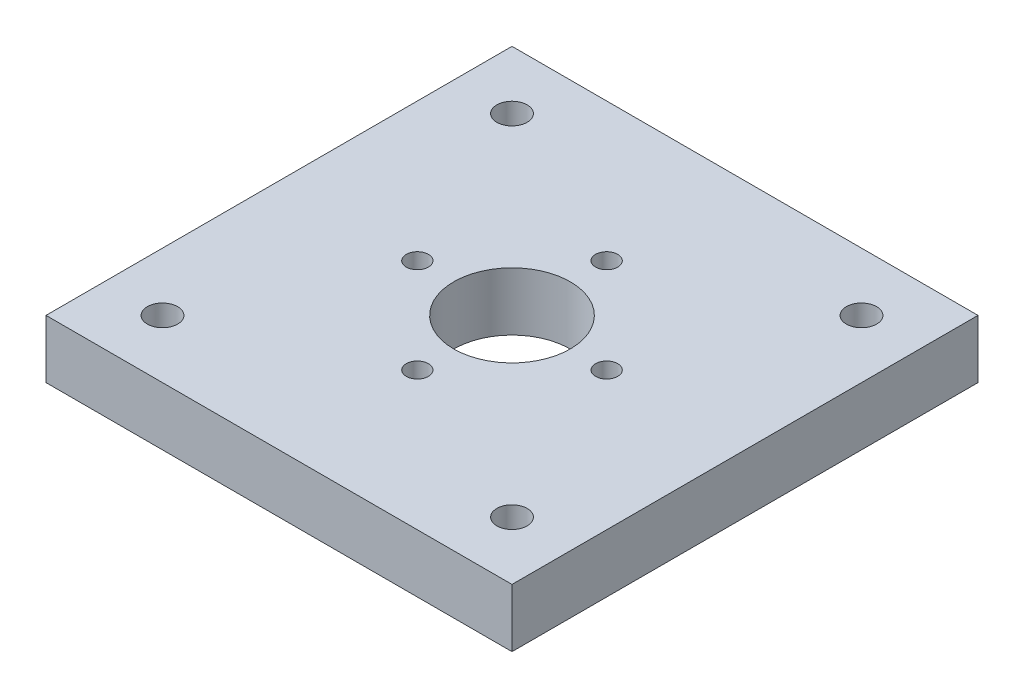
ISO-10303-21;
HEADER;
FILE_DESCRIPTION(('STEP AP214'),'2;1');
FILE_NAME('part.step','',(''),(''),'','','');
FILE_SCHEMA(('AUTOMOTIVE_DESIGN { 1 0 10303 214 1 1 1 1 }'));
ENDSEC;
DATA;
#1=APPLICATION_CONTEXT('core data for automotive mechanical design processes');
#2=APPLICATION_PROTOCOL_DEFINITION('international standard','automotive_design',2000,#1);
#3=PRODUCT_CONTEXT('',#1,'mechanical');
#4=PRODUCT('Part','Part','',(#3));
#5=PRODUCT_RELATED_PRODUCT_CATEGORY('part','',(#4));
#6=PRODUCT_DEFINITION_FORMATION('','',#4);
#7=PRODUCT_DEFINITION_CONTEXT('part definition',#1,'design');
#8=PRODUCT_DEFINITION('design','',#6,#7);
#9=PRODUCT_DEFINITION_SHAPE('','',#8);
#10=(LENGTH_UNIT() NAMED_UNIT(*) SI_UNIT(.MILLI.,.METRE.));
#11=(NAMED_UNIT(*) PLANE_ANGLE_UNIT() SI_UNIT($,.RADIAN.));
#12=(NAMED_UNIT(*) SI_UNIT($,.STERADIAN.) SOLID_ANGLE_UNIT());
#13=UNCERTAINTY_MEASURE_WITH_UNIT(LENGTH_MEASURE(1.E-05),#10,'distance_accuracy_value','');
#14=(GEOMETRIC_REPRESENTATION_CONTEXT(3) GLOBAL_UNCERTAINTY_ASSIGNED_CONTEXT((#13)) GLOBAL_UNIT_ASSIGNED_CONTEXT((#10,
#11,#12)) REPRESENTATION_CONTEXT('',''));
#15=CARTESIAN_POINT('',(0.,0.,0.));
#16=DIRECTION('',(0.,0.,1.));
#17=DIRECTION('',(1.,0.,0.));
#18=AXIS2_PLACEMENT_3D('',#15,#16,#17);
#19=CARTESIAN_POINT('',(0.,0.5,0.));
#20=DIRECTION('',(0.,1.,0.));
#21=DIRECTION('',(0.,0.,1.));
#22=AXIS2_PLACEMENT_3D('',#19,#20,#21);
#23=PLANE('',#22);
#24=CARTESIAN_POINT('',(0.,0.5,0.812500000000001));
#25=DIRECTION('',(0.,1.,0.));
#26=DIRECTION('',(0.,0.,1.));
#27=AXIS2_PLACEMENT_3D('',#24,#25,#26);
#28=CIRCLE('',#27,0.095);
#29=CARTESIAN_POINT('',(0.,0.5,0.907500000000001));
#30=VERTEX_POINT('',#29);
#31=EDGE_CURVE('E155',#30,#30,#28,.T.);
#32=ORIENTED_EDGE('',*,*,#31,.F.);
#33=EDGE_LOOP('',(#32));
#34=FACE_BOUND('',#33,.T.);
#35=CARTESIAN_POINT('',(0.,0.5,-0.812500000000001));
#36=DIRECTION('',(0.,1.,0.));
#37=DIRECTION('',(0.,0.,1.));
#38=AXIS2_PLACEMENT_3D('',#35,#36,#37);
#39=CIRCLE('',#38,0.095);
#40=CARTESIAN_POINT('',(0.,0.5,-0.717500000000001));
#41=VERTEX_POINT('',#40);
#42=EDGE_CURVE('E143',#41,#41,#39,.T.);
#43=ORIENTED_EDGE('',*,*,#42,.F.);
#44=EDGE_LOOP('',(#43));
#45=FACE_BOUND('',#44,.T.);
#46=CARTESIAN_POINT('',(-1.5,0.5,1.5));
#47=DIRECTION('',(0.,1.,0.));
#48=DIRECTION('',(0.,0.,-1.));
#49=AXIS2_PLACEMENT_3D('',#46,#47,#48);
#50=CIRCLE('',#49,0.13);
#51=CARTESIAN_POINT('',(-1.5,0.5,1.37));
#52=VERTEX_POINT('',#51);
#53=EDGE_CURVE('E131',#52,#52,#50,.T.);
#54=ORIENTED_EDGE('',*,*,#53,.F.);
#55=EDGE_LOOP('',(#54));
#56=FACE_BOUND('',#55,.T.);
#57=CARTESIAN_POINT('',(1.5,0.5,-1.5));
#58=DIRECTION('',(0.,1.,0.));
#59=DIRECTION('',(0.,0.,-1.));
#60=AXIS2_PLACEMENT_3D('',#57,#58,#59);
#61=CIRCLE('',#60,0.13);
#62=CARTESIAN_POINT('',(1.5,0.5,-1.63));
#63=VERTEX_POINT('',#62);
#64=EDGE_CURVE('E119',#63,#63,#61,.T.);
#65=ORIENTED_EDGE('',*,*,#64,.F.);
#66=EDGE_LOOP('',(#65));
#67=FACE_BOUND('',#66,.T.);
#68=DIRECTION('',(0.,0.,-1.));
#69=VECTOR('',#68,1.);
#70=CARTESIAN_POINT('',(2.,0.5,-2.));
#71=LINE('',#70,#69);
#72=CARTESIAN_POINT('',(2.,0.5,2.));
#73=VERTEX_POINT('',#72);
#74=CARTESIAN_POINT('',(2.,0.5,-2.));
#75=VERTEX_POINT('',#74);
#76=EDGE_CURVE('E89',#73,#75,#71,.T.);
#77=ORIENTED_EDGE('',*,*,#76,.T.);
#78=DIRECTION('',(-1.,0.,0.));
#79=VECTOR('',#78,1.);
#80=CARTESIAN_POINT('',(-2.,0.5,-2.));
#81=LINE('',#80,#79);
#82=CARTESIAN_POINT('',(-2.,0.5,-2.));
#83=VERTEX_POINT('',#82);
#84=EDGE_CURVE('E84',#75,#83,#81,.T.);
#85=ORIENTED_EDGE('',*,*,#84,.T.);
#86=DIRECTION('',(0.,0.,1.));
#87=VECTOR('',#86,1.);
#88=CARTESIAN_POINT('',(-2.,0.5,-2.));
#89=LINE('',#88,#87);
#90=CARTESIAN_POINT('',(-2.,0.5,2.));
#91=VERTEX_POINT('',#90);
#92=EDGE_CURVE('E87',#83,#91,#89,.T.);
#93=ORIENTED_EDGE('',*,*,#92,.T.);
#94=DIRECTION('',(1.,0.,0.));
#95=VECTOR('',#94,1.);
#96=CARTESIAN_POINT('',(-2.,0.5,2.));
#97=LINE('',#96,#95);
#98=EDGE_CURVE('E54',#91,#73,#97,.T.);
#99=ORIENTED_EDGE('',*,*,#98,.T.);
#100=EDGE_LOOP('',(#77,#85,#93,#99));
#101=FACE_BOUND('',#100,.T.);
#102=CARTESIAN_POINT('',(-1.5,0.5,-1.5));
#103=DIRECTION('',(0.,1.,0.));
#104=DIRECTION('',(0.,0.,1.));
#105=AXIS2_PLACEMENT_3D('',#102,#103,#104);
#106=CIRCLE('',#105,0.13);
#107=CARTESIAN_POINT('',(-1.5,0.5,-1.37));
#108=VERTEX_POINT('',#107);
#109=EDGE_CURVE('E104',#108,#108,#106,.T.);
#110=ORIENTED_EDGE('',*,*,#109,.F.);
#111=EDGE_LOOP('',(#110));
#112=FACE_BOUND('',#111,.T.);
#113=CARTESIAN_POINT('',(1.5,0.5,1.5));
#114=DIRECTION('',(0.,1.,0.));
#115=DIRECTION('',(0.,0.,1.));
#116=AXIS2_PLACEMENT_3D('',#113,#114,#115);
#117=CIRCLE('',#116,0.13);
#118=CARTESIAN_POINT('',(1.5,0.5,1.63));
#119=VERTEX_POINT('',#118);
#120=EDGE_CURVE('E125',#119,#119,#117,.T.);
#121=ORIENTED_EDGE('',*,*,#120,.F.);
#122=EDGE_LOOP('',(#121));
#123=FACE_BOUND('',#122,.T.);
#124=CARTESIAN_POINT('',(0.,0.5,0.));
#125=DIRECTION('',(0.,1.,0.));
#126=DIRECTION('',(0.,0.,1.));
#127=AXIS2_PLACEMENT_3D('',#124,#125,#126);
#128=CIRCLE('',#127,0.5);
#129=CARTESIAN_POINT('',(0.,0.5,0.499999999999999));
#130=VERTEX_POINT('',#129);
#131=EDGE_CURVE('E137',#130,#130,#128,.T.);
#132=ORIENTED_EDGE('',*,*,#131,.F.);
#133=EDGE_LOOP('',(#132));
#134=FACE_BOUND('',#133,.T.);
#135=CARTESIAN_POINT('',(0.812500000000001,0.5,0.));
#136=DIRECTION('',(0.,1.,0.));
#137=DIRECTION('',(0.,0.,1.));
#138=AXIS2_PLACEMENT_3D('',#135,#136,#137);
#139=CIRCLE('',#138,0.095);
#140=CARTESIAN_POINT('',(0.812500000000001,0.5,0.0950000000000037));
#141=VERTEX_POINT('',#140);
#142=EDGE_CURVE('E149',#141,#141,#139,.T.);
#143=ORIENTED_EDGE('',*,*,#142,.F.);
#144=EDGE_LOOP('',(#143));
#145=FACE_BOUND('',#144,.T.);
#146=CARTESIAN_POINT('',(-0.812500000000001,0.5,0.));
#147=DIRECTION('',(0.,1.,0.));
#148=DIRECTION('',(0.,0.,1.));
#149=AXIS2_PLACEMENT_3D('',#146,#147,#148);
#150=CIRCLE('',#149,0.095);
#151=CARTESIAN_POINT('',(-0.812500000000001,0.5,0.0949999999999906));
#152=VERTEX_POINT('',#151);
#153=EDGE_CURVE('E161',#152,#152,#150,.T.);
#154=ORIENTED_EDGE('',*,*,#153,.F.);
#155=EDGE_LOOP('',(#154));
#156=FACE_BOUND('',#155,.T.);
#157=ADVANCED_FACE('F37',(#34,#45,#56,#67,#101,#112,#123,#134,#145,#156),#23,.T.);
#158=CARTESIAN_POINT('',(0.,0.,0.));
#159=DIRECTION('',(0.,1.,0.));
#160=DIRECTION('',(0.,0.,1.));
#161=AXIS2_PLACEMENT_3D('',#158,#159,#160);
#162=PLANE('',#161);
#163=DIRECTION('',(0.,0.,-1.));
#164=VECTOR('',#163,1.);
#165=CARTESIAN_POINT('',(2.,0.,-2.));
#166=LINE('',#165,#164);
#167=CARTESIAN_POINT('',(2.,0.,2.));
#168=VERTEX_POINT('',#167);
#169=CARTESIAN_POINT('',(2.,0.,-2.));
#170=VERTEX_POINT('',#169);
#171=EDGE_CURVE('E101',#168,#170,#166,.T.);
#172=ORIENTED_EDGE('',*,*,#171,.F.);
#173=DIRECTION('',(1.,0.,0.));
#174=VECTOR('',#173,1.);
#175=CARTESIAN_POINT('',(-2.,0.,2.));
#176=LINE('',#175,#174);
#177=CARTESIAN_POINT('',(-2.,0.,2.));
#178=VERTEX_POINT('',#177);
#179=EDGE_CURVE('E77',#178,#168,#176,.T.);
#180=ORIENTED_EDGE('',*,*,#179,.F.);
#181=DIRECTION('',(0.,0.,1.));
#182=VECTOR('',#181,1.);
#183=CARTESIAN_POINT('',(-2.,0.,-2.));
#184=LINE('',#183,#182);
#185=CARTESIAN_POINT('',(-2.,0.,-2.));
#186=VERTEX_POINT('',#185);
#187=EDGE_CURVE('E71',#186,#178,#184,.T.);
#188=ORIENTED_EDGE('',*,*,#187,.F.);
#189=DIRECTION('',(-1.,0.,0.));
#190=VECTOR('',#189,1.);
#191=CARTESIAN_POINT('',(-2.,0.,-2.));
#192=LINE('',#191,#190);
#193=EDGE_CURVE('E93',#170,#186,#192,.T.);
#194=ORIENTED_EDGE('',*,*,#193,.F.);
#195=EDGE_LOOP('',(#172,#180,#188,#194));
#196=FACE_BOUND('',#195,.T.);
#197=CARTESIAN_POINT('',(-1.5,0.,-1.5));
#198=DIRECTION('',(0.,1.,0.));
#199=DIRECTION('',(0.,0.,1.));
#200=AXIS2_PLACEMENT_3D('',#197,#198,#199);
#201=CIRCLE('',#200,0.13);
#202=CARTESIAN_POINT('',(-1.5,0.,-1.37));
#203=VERTEX_POINT('',#202);
#204=EDGE_CURVE('E116',#203,#203,#201,.T.);
#205=ORIENTED_EDGE('',*,*,#204,.T.);
#206=EDGE_LOOP('',(#205));
#207=FACE_BOUND('',#206,.T.);
#208=CARTESIAN_POINT('',(1.5,0.,-1.5));
#209=DIRECTION('',(0.,1.,0.));
#210=DIRECTION('',(0.,0.,-1.));
#211=AXIS2_PLACEMENT_3D('',#208,#209,#210);
#212=CIRCLE('',#211,0.13);
#213=CARTESIAN_POINT('',(1.5,0.,-1.63));
#214=VERTEX_POINT('',#213);
#215=EDGE_CURVE('E122',#214,#214,#212,.T.);
#216=ORIENTED_EDGE('',*,*,#215,.T.);
#217=EDGE_LOOP('',(#216));
#218=FACE_BOUND('',#217,.T.);
#219=CARTESIAN_POINT('',(1.5,0.,1.5));
#220=DIRECTION('',(0.,1.,0.));
#221=DIRECTION('',(0.,0.,1.));
#222=AXIS2_PLACEMENT_3D('',#219,#220,#221);
#223=CIRCLE('',#222,0.13);
#224=CARTESIAN_POINT('',(1.5,0.,1.63));
#225=VERTEX_POINT('',#224);
#226=EDGE_CURVE('E128',#225,#225,#223,.T.);
#227=ORIENTED_EDGE('',*,*,#226,.T.);
#228=EDGE_LOOP('',(#227));
#229=FACE_BOUND('',#228,.T.);
#230=CARTESIAN_POINT('',(-1.5,0.,1.5));
#231=DIRECTION('',(0.,1.,0.));
#232=DIRECTION('',(0.,0.,-1.));
#233=AXIS2_PLACEMENT_3D('',#230,#231,#232);
#234=CIRCLE('',#233,0.13);
#235=CARTESIAN_POINT('',(-1.5,0.,1.37));
#236=VERTEX_POINT('',#235);
#237=EDGE_CURVE('E134',#236,#236,#234,.T.);
#238=ORIENTED_EDGE('',*,*,#237,.T.);
#239=EDGE_LOOP('',(#238));
#240=FACE_BOUND('',#239,.T.);
#241=CARTESIAN_POINT('',(0.,0.,0.));
#242=DIRECTION('',(0.,1.,0.));
#243=DIRECTION('',(0.,0.,1.));
#244=AXIS2_PLACEMENT_3D('',#241,#242,#243);
#245=CIRCLE('',#244,0.5);
#246=CARTESIAN_POINT('',(0.,0.,0.499999999999999));
#247=VERTEX_POINT('',#246);
#248=EDGE_CURVE('E140',#247,#247,#245,.T.);
#249=ORIENTED_EDGE('',*,*,#248,.T.);
#250=EDGE_LOOP('',(#249));
#251=FACE_BOUND('',#250,.T.);
#252=CARTESIAN_POINT('',(0.,0.,-0.812500000000001));
#253=DIRECTION('',(0.,1.,0.));
#254=DIRECTION('',(0.,0.,1.));
#255=AXIS2_PLACEMENT_3D('',#252,#253,#254);
#256=CIRCLE('',#255,0.095);
#257=CARTESIAN_POINT('',(0.,0.,-0.717500000000001));
#258=VERTEX_POINT('',#257);
#259=EDGE_CURVE('E146',#258,#258,#256,.T.);
#260=ORIENTED_EDGE('',*,*,#259,.T.);
#261=EDGE_LOOP('',(#260));
#262=FACE_BOUND('',#261,.T.);
#263=CARTESIAN_POINT('',(0.812500000000001,0.,0.));
#264=DIRECTION('',(0.,1.,0.));
#265=DIRECTION('',(0.,0.,1.));
#266=AXIS2_PLACEMENT_3D('',#263,#264,#265);
#267=CIRCLE('',#266,0.095);
#268=CARTESIAN_POINT('',(0.812500000000001,0.,0.0950000000000037));
#269=VERTEX_POINT('',#268);
#270=EDGE_CURVE('E152',#269,#269,#267,.T.);
#271=ORIENTED_EDGE('',*,*,#270,.T.);
#272=EDGE_LOOP('',(#271));
#273=FACE_BOUND('',#272,.T.);
#274=CARTESIAN_POINT('',(0.,0.,0.812500000000001));
#275=DIRECTION('',(0.,1.,0.));
#276=DIRECTION('',(0.,0.,1.));
#277=AXIS2_PLACEMENT_3D('',#274,#275,#276);
#278=CIRCLE('',#277,0.095);
#279=CARTESIAN_POINT('',(0.,0.,0.907500000000001));
#280=VERTEX_POINT('',#279);
#281=EDGE_CURVE('E158',#280,#280,#278,.T.);
#282=ORIENTED_EDGE('',*,*,#281,.T.);
#283=EDGE_LOOP('',(#282));
#284=FACE_BOUND('',#283,.T.);
#285=CARTESIAN_POINT('',(-0.812500000000001,0.,0.));
#286=DIRECTION('',(0.,1.,0.));
#287=DIRECTION('',(0.,0.,1.));
#288=AXIS2_PLACEMENT_3D('',#285,#286,#287);
#289=CIRCLE('',#288,0.095);
#290=CARTESIAN_POINT('',(-0.812500000000001,0.,0.0949999999999906));
#291=VERTEX_POINT('',#290);
#292=EDGE_CURVE('E164',#291,#291,#289,.T.);
#293=ORIENTED_EDGE('',*,*,#292,.T.);
#294=EDGE_LOOP('',(#293));
#295=FACE_BOUND('',#294,.T.);
#296=ADVANCED_FACE('F112',(#196,#207,#218,#229,#240,#251,#262,#273,#284,#295),#162,.F.);
#297=CARTESIAN_POINT('',(2.,0.5,-2.));
#298=DIRECTION('',(-1.,0.,0.));
#299=DIRECTION('',(0.,0.,1.));
#300=AXIS2_PLACEMENT_3D('',#297,#298,#299);
#301=PLANE('',#300);
#302=ORIENTED_EDGE('',*,*,#171,.T.);
#303=DIRECTION('',(0.,-1.,0.));
#304=VECTOR('',#303,1.);
#305=CARTESIAN_POINT('',(2.,0.5,-2.));
#306=LINE('',#305,#304);
#307=EDGE_CURVE('E11',#75,#170,#306,.T.);
#308=ORIENTED_EDGE('',*,*,#307,.F.);
#309=ORIENTED_EDGE('',*,*,#76,.F.);
#310=DIRECTION('',(0.,-1.,0.));
#311=VECTOR('',#310,1.);
#312=CARTESIAN_POINT('',(2.,0.5,2.));
#313=LINE('',#312,#311);
#314=EDGE_CURVE('E97',#73,#168,#313,.T.);
#315=ORIENTED_EDGE('',*,*,#314,.T.);
#316=EDGE_LOOP('',(#302,#308,#309,#315));
#317=FACE_BOUND('',#316,.T.);
#318=ADVANCED_FACE('F39',(#317),#301,.F.);
#319=CARTESIAN_POINT('',(-2.,0.5,-2.));
#320=DIRECTION('',(0.,0.,1.));
#321=DIRECTION('',(1.,0.,0.));
#322=AXIS2_PLACEMENT_3D('',#319,#320,#321);
#323=PLANE('',#322);
#324=ORIENTED_EDGE('',*,*,#193,.T.);
#325=DIRECTION('',(0.,-1.,0.));
#326=VECTOR('',#325,1.);
#327=CARTESIAN_POINT('',(-2.,0.5,-2.));
#328=LINE('',#327,#326);
#329=EDGE_CURVE('E46',#83,#186,#328,.T.);
#330=ORIENTED_EDGE('',*,*,#329,.F.);
#331=ORIENTED_EDGE('',*,*,#84,.F.);
#332=ORIENTED_EDGE('',*,*,#307,.T.);
#333=EDGE_LOOP('',(#324,#330,#331,#332));
#334=FACE_BOUND('',#333,.T.);
#335=ADVANCED_FACE('F92',(#334),#323,.F.);
#336=CARTESIAN_POINT('',(-2.,0.5,-2.));
#337=DIRECTION('',(1.,0.,0.));
#338=DIRECTION('',(0.,0.,-1.));
#339=AXIS2_PLACEMENT_3D('',#336,#337,#338);
#340=PLANE('',#339);
#341=ORIENTED_EDGE('',*,*,#187,.T.);
#342=DIRECTION('',(0.,-1.,0.));
#343=VECTOR('',#342,1.);
#344=CARTESIAN_POINT('',(-2.,0.5,2.));
#345=LINE('',#344,#343);
#346=EDGE_CURVE('E94',#91,#178,#345,.T.);
#347=ORIENTED_EDGE('',*,*,#346,.F.);
#348=ORIENTED_EDGE('',*,*,#92,.F.);
#349=ORIENTED_EDGE('',*,*,#329,.T.);
#350=EDGE_LOOP('',(#341,#347,#348,#349));
#351=FACE_BOUND('',#350,.T.);
#352=ADVANCED_FACE('F95',(#351),#340,.F.);
#353=CARTESIAN_POINT('',(-2.,0.5,2.));
#354=DIRECTION('',(0.,0.,-1.));
#355=DIRECTION('',(-1.,0.,0.));
#356=AXIS2_PLACEMENT_3D('',#353,#354,#355);
#357=PLANE('',#356);
#358=ORIENTED_EDGE('',*,*,#179,.T.);
#359=ORIENTED_EDGE('',*,*,#314,.F.);
#360=ORIENTED_EDGE('',*,*,#98,.F.);
#361=ORIENTED_EDGE('',*,*,#346,.T.);
#362=EDGE_LOOP('',(#358,#359,#360,#361));
#363=FACE_BOUND('',#362,.T.);
#364=ADVANCED_FACE('F109',(#363),#357,.F.);
#365=CARTESIAN_POINT('',(-1.5,0.5,-1.5));
#366=DIRECTION('',(0.,-1.,0.));
#367=DIRECTION('',(0.,0.,-1.));
#368=AXIS2_PLACEMENT_3D('',#365,#366,#367);
#369=CYLINDRICAL_SURFACE('',#368,0.13);
#370=ORIENTED_EDGE('',*,*,#109,.T.);
#371=EDGE_LOOP('',(#370));
#372=FACE_BOUND('',#371,.T.);
#373=ORIENTED_EDGE('',*,*,#204,.F.);
#374=EDGE_LOOP('',(#373));
#375=FACE_BOUND('',#374,.T.);
#376=ADVANCED_FACE('F183',(#372,#375),#369,.F.);
#377=CARTESIAN_POINT('',(1.5,0.5,-1.5));
#378=DIRECTION('',(0.,-1.,0.));
#379=DIRECTION('',(0.,0.,-1.));
#380=AXIS2_PLACEMENT_3D('',#377,#378,#379);
#381=CYLINDRICAL_SURFACE('',#380,0.13);
#382=ORIENTED_EDGE('',*,*,#64,.T.);
#383=EDGE_LOOP('',(#382));
#384=FACE_BOUND('',#383,.T.);
#385=ORIENTED_EDGE('',*,*,#215,.F.);
#386=EDGE_LOOP('',(#385));
#387=FACE_BOUND('',#386,.T.);
#388=ADVANCED_FACE('F237',(#384,#387),#381,.F.);
#389=CARTESIAN_POINT('',(1.5,0.5,1.5));
#390=DIRECTION('',(0.,-1.,0.));
#391=DIRECTION('',(0.,0.,-1.));
#392=AXIS2_PLACEMENT_3D('',#389,#390,#391);
#393=CYLINDRICAL_SURFACE('',#392,0.13);
#394=ORIENTED_EDGE('',*,*,#120,.T.);
#395=EDGE_LOOP('',(#394));
#396=FACE_BOUND('',#395,.T.);
#397=ORIENTED_EDGE('',*,*,#226,.F.);
#398=EDGE_LOOP('',(#397));
#399=FACE_BOUND('',#398,.T.);
#400=ADVANCED_FACE('F246',(#396,#399),#393,.F.);
#401=CARTESIAN_POINT('',(-1.5,0.5,1.5));
#402=DIRECTION('',(0.,-1.,0.));
#403=DIRECTION('',(0.,0.,-1.));
#404=AXIS2_PLACEMENT_3D('',#401,#402,#403);
#405=CYLINDRICAL_SURFACE('',#404,0.13);
#406=ORIENTED_EDGE('',*,*,#53,.T.);
#407=EDGE_LOOP('',(#406));
#408=FACE_BOUND('',#407,.T.);
#409=ORIENTED_EDGE('',*,*,#237,.F.);
#410=EDGE_LOOP('',(#409));
#411=FACE_BOUND('',#410,.T.);
#412=ADVANCED_FACE('F255',(#408,#411),#405,.F.);
#413=CARTESIAN_POINT('',(0.,0.5,0.));
#414=DIRECTION('',(0.,-1.,0.));
#415=DIRECTION('',(0.,0.,-1.));
#416=AXIS2_PLACEMENT_3D('',#413,#414,#415);
#417=CYLINDRICAL_SURFACE('',#416,0.5);
#418=ORIENTED_EDGE('',*,*,#131,.T.);
#419=EDGE_LOOP('',(#418));
#420=FACE_BOUND('',#419,.T.);
#421=ORIENTED_EDGE('',*,*,#248,.F.);
#422=EDGE_LOOP('',(#421));
#423=FACE_BOUND('',#422,.T.);
#424=ADVANCED_FACE('F265',(#420,#423),#417,.F.);
#425=CARTESIAN_POINT('',(0.,0.5,-0.812500000000001));
#426=DIRECTION('',(0.,-1.,0.));
#427=DIRECTION('',(0.,0.,-1.));
#428=AXIS2_PLACEMENT_3D('',#425,#426,#427);
#429=CYLINDRICAL_SURFACE('',#428,0.095);
#430=ORIENTED_EDGE('',*,*,#42,.T.);
#431=EDGE_LOOP('',(#430));
#432=FACE_BOUND('',#431,.T.);
#433=ORIENTED_EDGE('',*,*,#259,.F.);
#434=EDGE_LOOP('',(#433));
#435=FACE_BOUND('',#434,.T.);
#436=ADVANCED_FACE('F275',(#432,#435),#429,.F.);
#437=CARTESIAN_POINT('',(0.812500000000001,0.5,0.));
#438=DIRECTION('',(0.,-1.,0.));
#439=DIRECTION('',(0.,0.,-1.));
#440=AXIS2_PLACEMENT_3D('',#437,#438,#439);
#441=CYLINDRICAL_SURFACE('',#440,0.095);
#442=ORIENTED_EDGE('',*,*,#142,.T.);
#443=EDGE_LOOP('',(#442));
#444=FACE_BOUND('',#443,.T.);
#445=ORIENTED_EDGE('',*,*,#270,.F.);
#446=EDGE_LOOP('',(#445));
#447=FACE_BOUND('',#446,.T.);
#448=ADVANCED_FACE('F285',(#444,#447),#441,.F.);
#449=CARTESIAN_POINT('',(0.,0.5,0.812500000000001));
#450=DIRECTION('',(0.,-1.,0.));
#451=DIRECTION('',(0.,0.,-1.));
#452=AXIS2_PLACEMENT_3D('',#449,#450,#451);
#453=CYLINDRICAL_SURFACE('',#452,0.095);
#454=ORIENTED_EDGE('',*,*,#31,.T.);
#455=EDGE_LOOP('',(#454));
#456=FACE_BOUND('',#455,.T.);
#457=ORIENTED_EDGE('',*,*,#281,.F.);
#458=EDGE_LOOP('',(#457));
#459=FACE_BOUND('',#458,.T.);
#460=ADVANCED_FACE('F295',(#456,#459),#453,.F.);
#461=CARTESIAN_POINT('',(-0.812500000000001,0.5,0.));
#462=DIRECTION('',(0.,-1.,0.));
#463=DIRECTION('',(0.,0.,-1.));
#464=AXIS2_PLACEMENT_3D('',#461,#462,#463);
#465=CYLINDRICAL_SURFACE('',#464,0.095);
#466=ORIENTED_EDGE('',*,*,#153,.T.);
#467=EDGE_LOOP('',(#466));
#468=FACE_BOUND('',#467,.T.);
#469=ORIENTED_EDGE('',*,*,#292,.F.);
#470=EDGE_LOOP('',(#469));
#471=FACE_BOUND('',#470,.T.);
#472=ADVANCED_FACE('F170',(#468,#471),#465,.F.);
#473=CLOSED_SHELL('',(#157,#296,#318,#335,#352,#364,#376,#388,#400,#412,#424,#436,#448,#460,#472));
#474=MANIFOLD_SOLID_BREP('B2',#473);
#475=ADVANCED_BREP_SHAPE_REPRESENTATION('',(#18,#474),#14);
#476=SHAPE_DEFINITION_REPRESENTATION(#9,#475);
ENDSEC;
END-ISO-10303-21;
